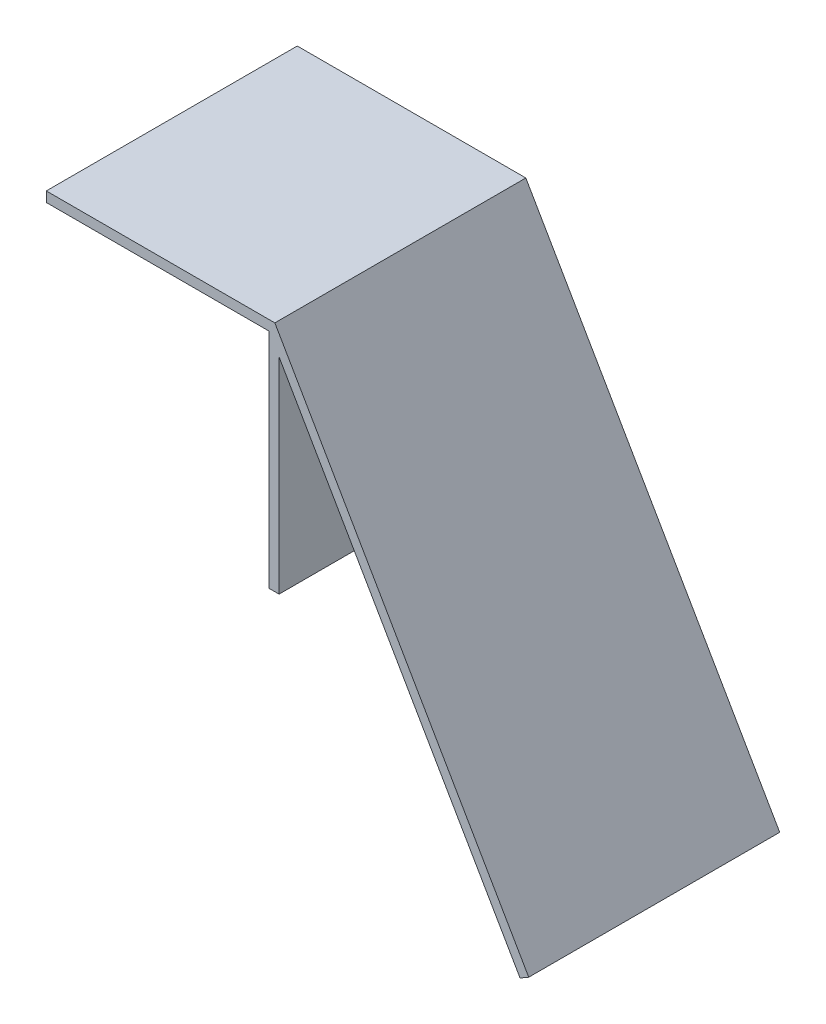
ISO-10303-21;
HEADER;
FILE_DESCRIPTION(('STEP AP214'),'2;1');
FILE_NAME('part.step','',(''),(''),'','','');
FILE_SCHEMA(('AUTOMOTIVE_DESIGN { 1 0 10303 214 1 1 1 1 }'));
ENDSEC;
DATA;
#1=APPLICATION_CONTEXT('core data for automotive mechanical design processes');
#2=APPLICATION_PROTOCOL_DEFINITION('international standard','automotive_design',2000,#1);
#3=PRODUCT_CONTEXT('',#1,'mechanical');
#4=PRODUCT('Part','Part','',(#3));
#5=PRODUCT_RELATED_PRODUCT_CATEGORY('part','',(#4));
#6=PRODUCT_DEFINITION_FORMATION('','',#4);
#7=PRODUCT_DEFINITION_CONTEXT('part definition',#1,'design');
#8=PRODUCT_DEFINITION('design','',#6,#7);
#9=PRODUCT_DEFINITION_SHAPE('','',#8);
#10=(LENGTH_UNIT() NAMED_UNIT(*) SI_UNIT(.MILLI.,.METRE.));
#11=(NAMED_UNIT(*) PLANE_ANGLE_UNIT() SI_UNIT($,.RADIAN.));
#12=(NAMED_UNIT(*) SI_UNIT($,.STERADIAN.) SOLID_ANGLE_UNIT());
#13=UNCERTAINTY_MEASURE_WITH_UNIT(LENGTH_MEASURE(1.E-05),#10,'distance_accuracy_value','');
#14=(GEOMETRIC_REPRESENTATION_CONTEXT(3) GLOBAL_UNCERTAINTY_ASSIGNED_CONTEXT((#13)) GLOBAL_UNIT_ASSIGNED_CONTEXT((#10,
#11,#12)) REPRESENTATION_CONTEXT('',''));
#15=CARTESIAN_POINT('',(0.,0.,0.));
#16=DIRECTION('',(0.,0.,1.));
#17=DIRECTION('',(1.,0.,0.));
#18=AXIS2_PLACEMENT_3D('',#15,#16,#17);
#19=CARTESIAN_POINT('',(0.,0.,25.));
#20=DIRECTION('',(1.,0.,0.));
#21=DIRECTION('',(0.,1.,0.));
#22=AXIS2_PLACEMENT_3D('',#19,#20,#21);
#23=PLANE('',#22);
#24=DIRECTION('',(0.,-1.,0.));
#25=VECTOR('',#24,1.);
#26=CARTESIAN_POINT('',(0.,0.,0.));
#27=LINE('',#26,#25);
#28=CARTESIAN_POINT('',(0.,0.,0.));
#29=VERTEX_POINT('',#28);
#30=CARTESIAN_POINT('',(0.,-1.,0.));
#31=VERTEX_POINT('',#30);
#32=EDGE_CURVE('E135',#29,#31,#27,.T.);
#33=ORIENTED_EDGE('',*,*,#32,.T.);
#34=DIRECTION('',(0.,0.,-1.));
#35=VECTOR('',#34,1.);
#36=CARTESIAN_POINT('',(0.,-1.,25.));
#37=LINE('',#36,#35);
#38=CARTESIAN_POINT('',(0.,-1.,25.));
#39=VERTEX_POINT('',#38);
#40=EDGE_CURVE('E11',#39,#31,#37,.T.);
#41=ORIENTED_EDGE('',*,*,#40,.F.);
#42=DIRECTION('',(0.,-1.,0.));
#43=VECTOR('',#42,1.);
#44=CARTESIAN_POINT('',(0.,0.,25.));
#45=LINE('',#44,#43);
#46=CARTESIAN_POINT('',(0.,0.,25.));
#47=VERTEX_POINT('',#46);
#48=EDGE_CURVE('E151',#47,#39,#45,.T.);
#49=ORIENTED_EDGE('',*,*,#48,.F.);
#50=DIRECTION('',(0.,0.,-1.));
#51=VECTOR('',#50,1.);
#52=CARTESIAN_POINT('',(0.,0.,25.));
#53=LINE('',#52,#51);
#54=EDGE_CURVE('E131',#47,#29,#53,.T.);
#55=ORIENTED_EDGE('',*,*,#54,.T.);
#56=EDGE_LOOP('',(#33,#41,#49,#55));
#57=FACE_BOUND('',#56,.T.);
#58=ADVANCED_FACE('F33',(#57),#23,.F.);
#59=CARTESIAN_POINT('',(0.,-1.,25.));
#60=DIRECTION('',(0.,1.,0.));
#61=DIRECTION('',(-1.,0.,0.));
#62=AXIS2_PLACEMENT_3D('',#59,#60,#61);
#63=PLANE('',#62);
#64=DIRECTION('',(1.,0.,0.));
#65=VECTOR('',#64,1.);
#66=CARTESIAN_POINT('',(0.,-1.,0.));
#67=LINE('',#66,#65);
#68=CARTESIAN_POINT('',(22.1890281502077,-1.,0.));
#69=VERTEX_POINT('',#68);
#70=EDGE_CURVE('E138',#31,#69,#67,.T.);
#71=ORIENTED_EDGE('',*,*,#70,.T.);
#72=DIRECTION('',(0.,0.,-1.));
#73=VECTOR('',#72,1.);
#74=CARTESIAN_POINT('',(22.1890281502077,-1.,25.));
#75=LINE('',#74,#73);
#76=CARTESIAN_POINT('',(22.1890281502077,-1.,25.));
#77=VERTEX_POINT('',#76);
#78=EDGE_CURVE('E41',#77,#69,#75,.T.);
#79=ORIENTED_EDGE('',*,*,#78,.F.);
#80=DIRECTION('',(1.,0.,0.));
#81=VECTOR('',#80,1.);
#82=CARTESIAN_POINT('',(0.,-1.,25.));
#83=LINE('',#82,#81);
#84=EDGE_CURVE('E95',#39,#77,#83,.T.);
#85=ORIENTED_EDGE('',*,*,#84,.F.);
#86=ORIENTED_EDGE('',*,*,#40,.T.);
#87=EDGE_LOOP('',(#71,#79,#85,#86));
#88=FACE_BOUND('',#87,.T.);
#89=ADVANCED_FACE('F194',(#88),#63,.F.);
#90=CARTESIAN_POINT('',(22.1890281502077,-1.,25.));
#91=DIRECTION('',(1.,0.,0.));
#92=DIRECTION('',(0.,1.,0.));
#93=AXIS2_PLACEMENT_3D('',#90,#91,#92);
#94=PLANE('',#93);
#95=DIRECTION('',(0.,-1.,0.));
#96=VECTOR('',#95,1.);
#97=CARTESIAN_POINT('',(22.1890281502077,-1.,0.));
#98=LINE('',#97,#96);
#99=CARTESIAN_POINT('',(22.1890281502077,-23.1890281502077,0.));
#100=VERTEX_POINT('',#99);
#101=EDGE_CURVE('E140',#69,#100,#98,.T.);
#102=ORIENTED_EDGE('',*,*,#101,.T.);
#103=DIRECTION('',(0.,0.,-1.));
#104=VECTOR('',#103,1.);
#105=CARTESIAN_POINT('',(22.1890281502077,-23.1890281502077,25.));
#106=LINE('',#105,#104);
#107=CARTESIAN_POINT('',(22.1890281502077,-23.1890281502077,25.));
#108=VERTEX_POINT('',#107);
#109=EDGE_CURVE('E161',#108,#100,#106,.T.);
#110=ORIENTED_EDGE('',*,*,#109,.F.);
#111=DIRECTION('',(0.,-1.,0.));
#112=VECTOR('',#111,1.);
#113=CARTESIAN_POINT('',(22.1890281502077,-1.,25.));
#114=LINE('',#113,#112);
#115=EDGE_CURVE('E169',#77,#108,#114,.T.);
#116=ORIENTED_EDGE('',*,*,#115,.F.);
#117=ORIENTED_EDGE('',*,*,#78,.T.);
#118=EDGE_LOOP('',(#102,#110,#116,#117));
#119=FACE_BOUND('',#118,.T.);
#120=ADVANCED_FACE('F167',(#119),#94,.F.);
#121=CARTESIAN_POINT('',(22.1890281502077,-23.1890281502077,25.));
#122=DIRECTION('',(0.,1.,0.));
#123=DIRECTION('',(-1.,0.,0.));
#124=AXIS2_PLACEMENT_3D('',#121,#122,#123);
#125=PLANE('',#124);
#126=DIRECTION('',(1.,0.,0.));
#127=VECTOR('',#126,1.);
#128=CARTESIAN_POINT('',(22.1890281502077,-23.1890281502077,0.));
#129=LINE('',#128,#127);
#130=CARTESIAN_POINT('',(23.1890281502077,-23.1890281502077,0.));
#131=VERTEX_POINT('',#130);
#132=EDGE_CURVE('E142',#100,#131,#129,.T.);
#133=ORIENTED_EDGE('',*,*,#132,.T.);
#134=DIRECTION('',(0.,0.,-1.));
#135=VECTOR('',#134,1.);
#136=CARTESIAN_POINT('',(23.1890281502077,-23.1890281502077,25.));
#137=LINE('',#136,#135);
#138=CARTESIAN_POINT('',(23.1890281502077,-23.1890281502077,25.));
#139=VERTEX_POINT('',#138);
#140=EDGE_CURVE('E158',#139,#131,#137,.T.);
#141=ORIENTED_EDGE('',*,*,#140,.F.);
#142=DIRECTION('',(1.,0.,0.));
#143=VECTOR('',#142,1.);
#144=CARTESIAN_POINT('',(22.1890281502077,-23.1890281502077,25.));
#145=LINE('',#144,#143);
#146=EDGE_CURVE('E185',#108,#139,#145,.T.);
#147=ORIENTED_EDGE('',*,*,#146,.F.);
#148=ORIENTED_EDGE('',*,*,#109,.T.);
#149=EDGE_LOOP('',(#133,#141,#147,#148));
#150=FACE_BOUND('',#149,.T.);
#151=ADVANCED_FACE('F178',(#150),#125,.F.);
#152=CARTESIAN_POINT('',(23.1890281502077,-2.73205080756893,25.));
#153=DIRECTION('',(-1.,0.,0.));
#154=DIRECTION('',(0.,-1.,0.));
#155=AXIS2_PLACEMENT_3D('',#152,#153,#154);
#156=PLANE('',#155);
#157=DIRECTION('',(0.,1.,0.));
#158=VECTOR('',#157,1.);
#159=CARTESIAN_POINT('',(23.1890281502077,-2.73205080756893,0.));
#160=LINE('',#159,#158);
#161=CARTESIAN_POINT('',(23.1890281502077,-2.73205080756893,0.));
#162=VERTEX_POINT('',#161);
#163=EDGE_CURVE('E144',#131,#162,#160,.T.);
#164=ORIENTED_EDGE('',*,*,#163,.T.);
#165=DIRECTION('',(0.,0.,-1.));
#166=VECTOR('',#165,1.);
#167=CARTESIAN_POINT('',(23.1890281502077,-2.73205080756893,25.));
#168=LINE('',#167,#166);
#169=CARTESIAN_POINT('',(23.1890281502077,-2.73205080756893,25.));
#170=VERTEX_POINT('',#169);
#171=EDGE_CURVE('E155',#170,#162,#168,.T.);
#172=ORIENTED_EDGE('',*,*,#171,.F.);
#173=DIRECTION('',(0.,1.,0.));
#174=VECTOR('',#173,1.);
#175=CARTESIAN_POINT('',(23.1890281502077,-2.73205080756893,25.));
#176=LINE('',#175,#174);
#177=EDGE_CURVE('E184',#139,#170,#176,.T.);
#178=ORIENTED_EDGE('',*,*,#177,.F.);
#179=ORIENTED_EDGE('',*,*,#140,.T.);
#180=EDGE_LOOP('',(#164,#172,#178,#179));
#181=FACE_BOUND('',#180,.T.);
#182=ADVANCED_FACE('F182',(#181),#156,.F.);
#183=CARTESIAN_POINT('',(47.1890281502076,-44.301270189222,25.));
#184=DIRECTION('',(0.86602540378444,0.499999999999998,0.));
#185=DIRECTION('',(-0.499999999999998,0.86602540378444,0.));
#186=AXIS2_PLACEMENT_3D('',#183,#184,#185);
#187=PLANE('',#186);
#188=DIRECTION('',(0.499999999999998,-0.86602540378444,0.));
#189=VECTOR('',#188,1.);
#190=CARTESIAN_POINT('',(47.1890281502076,-44.301270189222,0.));
#191=LINE('',#190,#189);
#192=CARTESIAN_POINT('',(47.1890281502076,-44.301270189222,0.));
#193=VERTEX_POINT('',#192);
#194=EDGE_CURVE('E146',#162,#193,#191,.T.);
#195=ORIENTED_EDGE('',*,*,#194,.T.);
#196=DIRECTION('',(0.,0.,-1.));
#197=VECTOR('',#196,1.);
#198=CARTESIAN_POINT('',(47.1890281502076,-44.301270189222,25.));
#199=LINE('',#198,#197);
#200=CARTESIAN_POINT('',(47.1890281502076,-44.301270189222,25.));
#201=VERTEX_POINT('',#200);
#202=EDGE_CURVE('E126',#201,#193,#199,.T.);
#203=ORIENTED_EDGE('',*,*,#202,.F.);
#204=DIRECTION('',(0.499999999999998,-0.86602540378444,0.));
#205=VECTOR('',#204,1.);
#206=CARTESIAN_POINT('',(47.1890281502076,-44.301270189222,25.));
#207=LINE('',#206,#205);
#208=EDGE_CURVE('E117',#170,#201,#207,.T.);
#209=ORIENTED_EDGE('',*,*,#208,.F.);
#210=ORIENTED_EDGE('',*,*,#171,.T.);
#211=EDGE_LOOP('',(#195,#203,#209,#210));
#212=FACE_BOUND('',#211,.T.);
#213=ADVANCED_FACE('F206',(#212),#187,.F.);
#214=CARTESIAN_POINT('',(48.055053553992,-43.801270189222,25.));
#215=DIRECTION('',(-0.500000000000004,0.866025403784436,0.));
#216=DIRECTION('',(-0.866025403784437,-0.500000000000004,0.));
#217=AXIS2_PLACEMENT_3D('',#214,#215,#216);
#218=PLANE('',#217);
#219=DIRECTION('',(0.866025403784437,0.500000000000004,0.));
#220=VECTOR('',#219,1.);
#221=CARTESIAN_POINT('',(48.055053553992,-43.801270189222,0.));
#222=LINE('',#221,#220);
#223=CARTESIAN_POINT('',(48.055053553992,-43.801270189222,0.));
#224=VERTEX_POINT('',#223);
#225=EDGE_CURVE('E125',#193,#224,#222,.T.);
#226=ORIENTED_EDGE('',*,*,#225,.T.);
#227=DIRECTION('',(0.,0.,-1.));
#228=VECTOR('',#227,1.);
#229=CARTESIAN_POINT('',(48.055053553992,-43.801270189222,25.));
#230=LINE('',#229,#228);
#231=CARTESIAN_POINT('',(48.055053553992,-43.801270189222,25.));
#232=VERTEX_POINT('',#231);
#233=EDGE_CURVE('E122',#232,#224,#230,.T.);
#234=ORIENTED_EDGE('',*,*,#233,.F.);
#235=DIRECTION('',(0.866025403784437,0.500000000000004,0.));
#236=VECTOR('',#235,1.);
#237=CARTESIAN_POINT('',(48.055053553992,-43.801270189222,25.));
#238=LINE('',#237,#236);
#239=EDGE_CURVE('E111',#201,#232,#238,.T.);
#240=ORIENTED_EDGE('',*,*,#239,.F.);
#241=ORIENTED_EDGE('',*,*,#202,.T.);
#242=EDGE_LOOP('',(#226,#234,#240,#241));
#243=FACE_BOUND('',#242,.T.);
#244=ADVANCED_FACE('F123',(#243),#218,.F.);
#245=CARTESIAN_POINT('',(22.7663784193973,0.,25.));
#246=DIRECTION('',(-0.86602540378444,-0.499999999999998,0.));
#247=DIRECTION('',(0.499999999999998,-0.86602540378444,0.));
#248=AXIS2_PLACEMENT_3D('',#245,#246,#247);
#249=PLANE('',#248);
#250=DIRECTION('',(-0.499999999999998,0.86602540378444,0.));
#251=VECTOR('',#250,1.);
#252=CARTESIAN_POINT('',(22.7663784193973,0.,0.));
#253=LINE('',#252,#251);
#254=CARTESIAN_POINT('',(22.7663784193973,0.,0.));
#255=VERTEX_POINT('',#254);
#256=EDGE_CURVE('E81',#224,#255,#253,.T.);
#257=ORIENTED_EDGE('',*,*,#256,.T.);
#258=DIRECTION('',(0.,0.,-1.));
#259=VECTOR('',#258,1.);
#260=CARTESIAN_POINT('',(22.7663784193973,0.,25.));
#261=LINE('',#260,#259);
#262=CARTESIAN_POINT('',(22.7663784193973,0.,25.));
#263=VERTEX_POINT('',#262);
#264=EDGE_CURVE('E127',#263,#255,#261,.T.);
#265=ORIENTED_EDGE('',*,*,#264,.F.);
#266=DIRECTION('',(-0.499999999999998,0.86602540378444,0.));
#267=VECTOR('',#266,1.);
#268=CARTESIAN_POINT('',(22.7663784193973,0.,25.));
#269=LINE('',#268,#267);
#270=EDGE_CURVE('E115',#232,#263,#269,.T.);
#271=ORIENTED_EDGE('',*,*,#270,.F.);
#272=ORIENTED_EDGE('',*,*,#233,.T.);
#273=EDGE_LOOP('',(#257,#265,#271,#272));
#274=FACE_BOUND('',#273,.T.);
#275=ADVANCED_FACE('F129',(#274),#249,.F.);
#276=CARTESIAN_POINT('',(0.,0.,25.));
#277=DIRECTION('',(0.,-1.,0.));
#278=DIRECTION('',(0.,0.,-1.));
#279=AXIS2_PLACEMENT_3D('',#276,#277,#278);
#280=PLANE('',#279);
#281=DIRECTION('',(-1.,0.,0.));
#282=VECTOR('',#281,1.);
#283=CARTESIAN_POINT('',(0.,0.,0.));
#284=LINE('',#283,#282);
#285=EDGE_CURVE('E87',#255,#29,#284,.T.);
#286=ORIENTED_EDGE('',*,*,#285,.T.);
#287=ORIENTED_EDGE('',*,*,#54,.F.);
#288=DIRECTION('',(-1.,0.,0.));
#289=VECTOR('',#288,1.);
#290=CARTESIAN_POINT('',(0.,0.,25.));
#291=LINE('',#290,#289);
#292=EDGE_CURVE('E49',#263,#47,#291,.T.);
#293=ORIENTED_EDGE('',*,*,#292,.F.);
#294=ORIENTED_EDGE('',*,*,#264,.T.);
#295=EDGE_LOOP('',(#286,#287,#293,#294));
#296=FACE_BOUND('',#295,.T.);
#297=ADVANCED_FACE('F214',(#296),#280,.F.);
#298=CARTESIAN_POINT('',(0.,0.,25.));
#299=DIRECTION('',(0.,0.,1.));
#300=DIRECTION('',(1.,0.,0.));
#301=AXIS2_PLACEMENT_3D('',#298,#299,#300);
#302=PLANE('',#301);
#303=ORIENTED_EDGE('',*,*,#48,.T.);
#304=ORIENTED_EDGE('',*,*,#84,.T.);
#305=ORIENTED_EDGE('',*,*,#115,.T.);
#306=ORIENTED_EDGE('',*,*,#146,.T.);
#307=ORIENTED_EDGE('',*,*,#177,.T.);
#308=ORIENTED_EDGE('',*,*,#208,.T.);
#309=ORIENTED_EDGE('',*,*,#239,.T.);
#310=ORIENTED_EDGE('',*,*,#270,.T.);
#311=ORIENTED_EDGE('',*,*,#292,.T.);
#312=EDGE_LOOP('',(#303,#304,#305,#306,#307,#308,#309,#310,#311));
#313=FACE_BOUND('',#312,.T.);
#314=ADVANCED_FACE('F113',(#313),#302,.T.);
#315=CARTESIAN_POINT('',(0.,0.,0.));
#316=DIRECTION('',(0.,0.,1.));
#317=DIRECTION('',(1.,0.,0.));
#318=AXIS2_PLACEMENT_3D('',#315,#316,#317);
#319=PLANE('',#318);
#320=ORIENTED_EDGE('',*,*,#32,.F.);
#321=ORIENTED_EDGE('',*,*,#285,.F.);
#322=ORIENTED_EDGE('',*,*,#256,.F.);
#323=ORIENTED_EDGE('',*,*,#225,.F.);
#324=ORIENTED_EDGE('',*,*,#194,.F.);
#325=ORIENTED_EDGE('',*,*,#163,.F.);
#326=ORIENTED_EDGE('',*,*,#132,.F.);
#327=ORIENTED_EDGE('',*,*,#101,.F.);
#328=ORIENTED_EDGE('',*,*,#70,.F.);
#329=EDGE_LOOP('',(#320,#321,#322,#323,#324,#325,#326,#327,#328));
#330=FACE_BOUND('',#329,.T.);
#331=ADVANCED_FACE('F173',(#330),#319,.F.);
#332=CLOSED_SHELL('',(#58,#89,#120,#151,#182,#213,#244,#275,#297,#314,#331));
#333=MANIFOLD_SOLID_BREP('B2',#332);
#334=ADVANCED_BREP_SHAPE_REPRESENTATION('',(#18,#333),#14);
#335=SHAPE_DEFINITION_REPRESENTATION(#9,#334);
ENDSEC;
END-ISO-10303-21;
